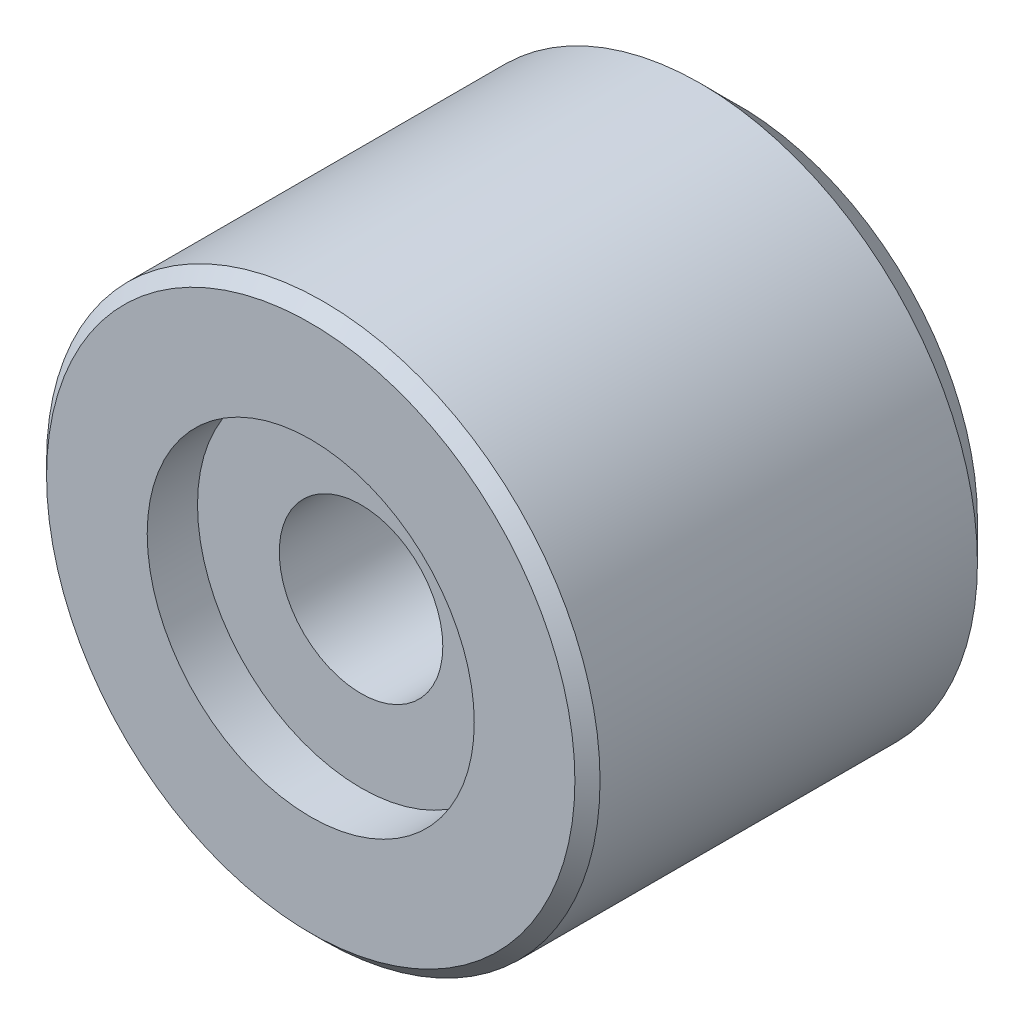
ISO-10303-21;
HEADER;
FILE_DESCRIPTION(('STEP AP214'),'2;1');
FILE_NAME('part.step','',(''),(''),'','','');
FILE_SCHEMA(('AUTOMOTIVE_DESIGN { 1 0 10303 214 1 1 1 1 }'));
ENDSEC;
DATA;
#1=APPLICATION_CONTEXT('core data for automotive mechanical design processes');
#2=APPLICATION_PROTOCOL_DEFINITION('international standard','automotive_design',2000,#1);
#3=PRODUCT_CONTEXT('',#1,'mechanical');
#4=PRODUCT('Part','Part','',(#3));
#5=PRODUCT_RELATED_PRODUCT_CATEGORY('part','',(#4));
#6=PRODUCT_DEFINITION_FORMATION('','',#4);
#7=PRODUCT_DEFINITION_CONTEXT('part definition',#1,'design');
#8=PRODUCT_DEFINITION('design','',#6,#7);
#9=PRODUCT_DEFINITION_SHAPE('','',#8);
#10=(LENGTH_UNIT() NAMED_UNIT(*) SI_UNIT(.MILLI.,.METRE.));
#11=(NAMED_UNIT(*) PLANE_ANGLE_UNIT() SI_UNIT($,.RADIAN.));
#12=(NAMED_UNIT(*) SI_UNIT($,.STERADIAN.) SOLID_ANGLE_UNIT());
#13=UNCERTAINTY_MEASURE_WITH_UNIT(LENGTH_MEASURE(1.E-05),#10,'distance_accuracy_value','');
#14=(GEOMETRIC_REPRESENTATION_CONTEXT(3) GLOBAL_UNCERTAINTY_ASSIGNED_CONTEXT((#13)) GLOBAL_UNIT_ASSIGNED_CONTEXT((#10,
#11,#12)) REPRESENTATION_CONTEXT('',''));
#15=CARTESIAN_POINT('',(0.,0.,0.));
#16=DIRECTION('',(0.,0.,1.));
#17=DIRECTION('',(1.,0.,0.));
#18=AXIS2_PLACEMENT_3D('',#15,#16,#17);
#19=CARTESIAN_POINT('',(1.6,2.82886903196313,4.5));
#20=DIRECTION('',(1.,0.,0.));
#21=DIRECTION('',(0.,0.,-1.));
#22=AXIS2_PLACEMENT_3D('',#19,#20,#21);
#23=PLANE('',#22);
#24=DIRECTION('',(0.,-1.,0.));
#25=VECTOR('',#24,1.);
#26=CARTESIAN_POINT('',(1.6,2.82886903196313,12.5));
#27=LINE('',#26,#25);
#28=CARTESIAN_POINT('',(1.6,2.82886903196313,12.5));
#29=VERTEX_POINT('',#28);
#30=CARTESIAN_POINT('',(1.6,-2.82886903196313,12.5));
#31=VERTEX_POINT('',#30);
#32=EDGE_CURVE('E60',#29,#31,#27,.T.);
#33=ORIENTED_EDGE('',*,*,#32,.F.);
#34=DIRECTION('',(0.,0.,1.));
#35=VECTOR('',#34,1.);
#36=CARTESIAN_POINT('',(1.6,2.82886903196313,4.5));
#37=LINE('',#36,#35);
#38=CARTESIAN_POINT('',(1.6,2.82886903196313,4.5));
#39=VERTEX_POINT('',#38);
#40=EDGE_CURVE('E54',#39,#29,#37,.T.);
#41=ORIENTED_EDGE('',*,*,#40,.F.);
#42=DIRECTION('',(0.,1.,0.));
#43=VECTOR('',#42,1.);
#44=CARTESIAN_POINT('',(1.6,2.82886903196313,4.5));
#45=LINE('',#44,#43);
#46=CARTESIAN_POINT('',(1.6,-2.82886903196313,4.5));
#47=VERTEX_POINT('',#46);
#48=EDGE_CURVE('E71',#47,#39,#45,.T.);
#49=ORIENTED_EDGE('',*,*,#48,.F.);
#50=DIRECTION('',(0.,0.,1.));
#51=VECTOR('',#50,1.);
#52=CARTESIAN_POINT('',(1.6,-2.82886903196313,4.5));
#53=LINE('',#52,#51);
#54=EDGE_CURVE('E67',#47,#31,#53,.T.);
#55=ORIENTED_EDGE('',*,*,#54,.T.);
#56=EDGE_LOOP('',(#33,#41,#49,#55));
#57=FACE_BOUND('',#56,.T.);
#58=ADVANCED_FACE('F33',(#57),#23,.F.);
#59=CARTESIAN_POINT('',(0.,0.,17.));
#60=DIRECTION('',(0.,0.,-1.));
#61=DIRECTION('',(-1.,0.,0.));
#62=AXIS2_PLACEMENT_3D('',#59,#60,#61);
#63=CYLINDRICAL_SURFACE('',#62,11.);
#64=CARTESIAN_POINT('',(0.,0.,16.5));
#65=DIRECTION('',(0.,0.,1.));
#66=DIRECTION('',(1.,0.,0.));
#67=AXIS2_PLACEMENT_3D('',#64,#65,#66);
#68=CIRCLE('',#67,11.);
#69=CARTESIAN_POINT('',(11.,0.,16.5));
#70=VERTEX_POINT('',#69);
#71=EDGE_CURVE('E11',#70,#70,#68,.F.);
#72=ORIENTED_EDGE('',*,*,#71,.T.);
#73=EDGE_LOOP('',(#72));
#74=FACE_BOUND('',#73,.T.);
#75=CARTESIAN_POINT('',(0.,0.,1.5));
#76=DIRECTION('',(0.,0.,1.));
#77=DIRECTION('',(1.,0.,0.));
#78=AXIS2_PLACEMENT_3D('',#75,#76,#77);
#79=CIRCLE('',#78,11.);
#80=CARTESIAN_POINT('',(11.,0.,1.5));
#81=VERTEX_POINT('',#80);
#82=EDGE_CURVE('E73',#81,#81,#79,.T.);
#83=ORIENTED_EDGE('',*,*,#82,.T.);
#84=EDGE_LOOP('',(#83));
#85=FACE_BOUND('',#84,.T.);
#86=ADVANCED_FACE('F97',(#74,#85),#63,.T.);
#87=CARTESIAN_POINT('',(0.,0.,17.));
#88=DIRECTION('',(0.,0.,1.));
#89=DIRECTION('',(1.,0.,0.));
#90=AXIS2_PLACEMENT_3D('',#87,#88,#89);
#91=PLANE('',#90);
#92=CARTESIAN_POINT('',(0.,0.,17.));
#93=DIRECTION('',(0.,0.,1.));
#94=DIRECTION('',(1.,0.,0.));
#95=AXIS2_PLACEMENT_3D('',#92,#93,#94);
#96=CIRCLE('',#95,10.5);
#97=CARTESIAN_POINT('',(10.5,0.,17.));
#98=VERTEX_POINT('',#97);
#99=EDGE_CURVE('E41',#98,#98,#96,.T.);
#100=ORIENTED_EDGE('',*,*,#99,.T.);
#101=EDGE_LOOP('',(#100));
#102=FACE_BOUND('',#101,.T.);
#103=CARTESIAN_POINT('',(0.,0.,17.));
#104=DIRECTION('',(0.,0.,1.));
#105=DIRECTION('',(1.,0.,0.));
#106=AXIS2_PLACEMENT_3D('',#103,#104,#105);
#107=CIRCLE('',#106,6.5);
#108=CARTESIAN_POINT('',(6.5,0.,17.));
#109=VERTEX_POINT('',#108);
#110=EDGE_CURVE('E63',#109,#109,#107,.T.);
#111=ORIENTED_EDGE('',*,*,#110,.F.);
#112=EDGE_LOOP('',(#111));
#113=FACE_BOUND('',#112,.T.);
#114=ADVANCED_FACE('F85',(#102,#113),#91,.T.);
#115=CARTESIAN_POINT('',(0.,0.,0.));
#116=DIRECTION('',(0.,0.,1.));
#117=DIRECTION('',(1.,0.,0.));
#118=AXIS2_PLACEMENT_3D('',#115,#116,#117);
#119=PLANE('',#118);
#120=CARTESIAN_POINT('',(0.,0.,0.));
#121=DIRECTION('',(0.,0.,1.));
#122=DIRECTION('',(1.,0.,0.));
#123=AXIS2_PLACEMENT_3D('',#120,#121,#122);
#124=CIRCLE('',#123,9.5);
#125=CARTESIAN_POINT('',(9.5,0.,0.));
#126=VERTEX_POINT('',#125);
#127=EDGE_CURVE('E80',#126,#126,#124,.F.);
#128=ORIENTED_EDGE('',*,*,#127,.T.);
#129=EDGE_LOOP('',(#128));
#130=FACE_BOUND('',#129,.T.);
#131=ADVANCED_FACE('F113',(#130),#119,.F.);
#132=CARTESIAN_POINT('',(0.,0.,15.));
#133=DIRECTION('',(0.,0.,1.));
#134=DIRECTION('',(1.,0.,0.));
#135=AXIS2_PLACEMENT_3D('',#132,#133,#134);
#136=PLANE('',#135);
#137=CARTESIAN_POINT('',(0.,0.,15.));
#138=DIRECTION('',(0.,0.,1.));
#139=DIRECTION('',(1.,0.,0.));
#140=AXIS2_PLACEMENT_3D('',#137,#138,#139);
#141=CIRCLE('',#140,3.25);
#142=CARTESIAN_POINT('',(3.25,0.,15.));
#143=VERTEX_POINT('',#142);
#144=EDGE_CURVE('E198',#143,#143,#141,.F.);
#145=ORIENTED_EDGE('',*,*,#144,.T.);
#146=EDGE_LOOP('',(#145));
#147=FACE_BOUND('',#146,.T.);
#148=CARTESIAN_POINT('',(0.,0.,15.));
#149=DIRECTION('',(0.,0.,1.));
#150=DIRECTION('',(1.,0.,0.));
#151=AXIS2_PLACEMENT_3D('',#148,#149,#150);
#152=CIRCLE('',#151,6.5);
#153=CARTESIAN_POINT('',(6.5,0.,15.));
#154=VERTEX_POINT('',#153);
#155=EDGE_CURVE('E200',#154,#154,#152,.T.);
#156=ORIENTED_EDGE('',*,*,#155,.T.);
#157=EDGE_LOOP('',(#156));
#158=FACE_BOUND('',#157,.T.);
#159=ADVANCED_FACE('F115',(#147,#158),#136,.T.);
#160=CARTESIAN_POINT('',(0.,0.,15.));
#161=DIRECTION('',(0.,0.,1.));
#162=DIRECTION('',(1.,0.,0.));
#163=AXIS2_PLACEMENT_3D('',#160,#161,#162);
#164=CYLINDRICAL_SURFACE('',#163,6.5);
#165=ORIENTED_EDGE('',*,*,#155,.F.);
#166=EDGE_LOOP('',(#165));
#167=FACE_BOUND('',#166,.T.);
#168=ORIENTED_EDGE('',*,*,#110,.T.);
#169=EDGE_LOOP('',(#168));
#170=FACE_BOUND('',#169,.T.);
#171=ADVANCED_FACE('F120',(#167,#170),#164,.F.);
#172=CARTESIAN_POINT('',(0.,0.,4.5));
#173=DIRECTION('',(0.,0.,1.));
#174=DIRECTION('',(1.,0.,0.));
#175=AXIS2_PLACEMENT_3D('',#172,#173,#174);
#176=PLANE('',#175);
#177=CARTESIAN_POINT('',(0.,0.,4.5));
#178=DIRECTION('',(0.,0.,1.));
#179=DIRECTION('',(1.,0.,0.));
#180=AXIS2_PLACEMENT_3D('',#177,#178,#179);
#181=CIRCLE('',#180,3.25);
#182=EDGE_CURVE('E75',#39,#47,#181,.T.);
#183=ORIENTED_EDGE('',*,*,#182,.T.);
#184=ORIENTED_EDGE('',*,*,#48,.T.);
#185=EDGE_LOOP('',(#183,#184));
#186=FACE_BOUND('',#185,.T.);
#187=ADVANCED_FACE('F106',(#186),#176,.T.);
#188=CARTESIAN_POINT('',(0.,0.,4.5));
#189=DIRECTION('',(0.,0.,1.));
#190=DIRECTION('',(1.,0.,0.));
#191=AXIS2_PLACEMENT_3D('',#188,#189,#190);
#192=CYLINDRICAL_SURFACE('',#191,3.25);
#193=ORIENTED_EDGE('',*,*,#144,.F.);
#194=EDGE_LOOP('',(#193));
#195=FACE_BOUND('',#194,.T.);
#196=ORIENTED_EDGE('',*,*,#40,.T.);
#197=CARTESIAN_POINT('',(0.,0.,12.5));
#198=DIRECTION('',(0.,0.,1.));
#199=DIRECTION('',(1.,0.,0.));
#200=AXIS2_PLACEMENT_3D('',#197,#198,#199);
#201=CIRCLE('',#200,3.25);
#202=EDGE_CURVE('E47',#31,#29,#201,.T.);
#203=ORIENTED_EDGE('',*,*,#202,.F.);
#204=ORIENTED_EDGE('',*,*,#54,.F.);
#205=ORIENTED_EDGE('',*,*,#182,.F.);
#206=EDGE_LOOP('',(#196,#203,#204,#205));
#207=FACE_BOUND('',#206,.T.);
#208=ADVANCED_FACE('F66',(#195,#207),#192,.F.);
#209=CARTESIAN_POINT('',(0.,0.,12.5));
#210=DIRECTION('',(0.,0.,1.));
#211=DIRECTION('',(1.,0.,0.));
#212=AXIS2_PLACEMENT_3D('',#209,#210,#211);
#213=PLANE('',#212);
#214=ORIENTED_EDGE('',*,*,#32,.T.);
#215=ORIENTED_EDGE('',*,*,#202,.T.);
#216=EDGE_LOOP('',(#214,#215));
#217=FACE_BOUND('',#216,.T.);
#218=ADVANCED_FACE('F61',(#217),#213,.T.);
#219=CARTESIAN_POINT('',(0.,0.,1.5));
#220=DIRECTION('',(0.,0.,1.));
#221=DIRECTION('',(1.,0.,0.));
#222=AXIS2_PLACEMENT_3D('',#219,#220,#221);
#223=CONICAL_SURFACE('',#222,11.,0.78539816339745);
#224=CARTESIAN_POINT('',(9.5,0.,0.));
#225=CARTESIAN_POINT('',(9.515625,0.,0.0156249999999997));
#226=CARTESIAN_POINT('',(9.53125,0.,0.0312499999999996));
#227=CARTESIAN_POINT('',(9.5625,0.,0.0624999999999996));
#228=CARTESIAN_POINT('',(9.578125,0.,0.0781249999999997));
#229=CARTESIAN_POINT('',(9.609375,0.,0.109375));
#230=CARTESIAN_POINT('',(9.625,0.,0.125));
#231=CARTESIAN_POINT('',(9.65625,0.,0.156249999999999));
#232=CARTESIAN_POINT('',(9.671875,0.,0.171874999999999));
#233=CARTESIAN_POINT('',(9.703125,0.,0.203124999999999));
#234=CARTESIAN_POINT('',(9.71875,0.,0.218749999999999));
#235=CARTESIAN_POINT('',(9.75,0.,0.249999999999999));
#236=CARTESIAN_POINT('',(9.765625,0.,0.265624999999999));
#237=CARTESIAN_POINT('',(9.796875,0.,0.296874999999999));
#238=CARTESIAN_POINT('',(9.8125,0.,0.312499999999999));
#239=CARTESIAN_POINT('',(9.84375,0.,0.343749999999999));
#240=CARTESIAN_POINT('',(9.859375,0.,0.359374999999999));
#241=CARTESIAN_POINT('',(9.890625,0.,0.390624999999999));
#242=CARTESIAN_POINT('',(9.90625,0.,0.406249999999999));
#243=CARTESIAN_POINT('',(9.9375,0.,0.437499999999999));
#244=CARTESIAN_POINT('',(9.953125,0.,0.453124999999999));
#245=CARTESIAN_POINT('',(9.984375,0.,0.484374999999999));
#246=CARTESIAN_POINT('',(10.,0.,0.499999999999999));
#247=CARTESIAN_POINT('',(10.03125,0.,0.531249999999998));
#248=CARTESIAN_POINT('',(10.046875,0.,0.546874999999998));
#249=CARTESIAN_POINT('',(10.078125,0.,0.578124999999998));
#250=CARTESIAN_POINT('',(10.09375,0.,0.593749999999998));
#251=CARTESIAN_POINT('',(10.125,0.,0.624999999999998));
#252=CARTESIAN_POINT('',(10.140625,0.,0.640624999999998));
#253=CARTESIAN_POINT('',(10.171875,0.,0.671874999999998));
#254=CARTESIAN_POINT('',(10.1875,0.,0.687499999999998));
#255=CARTESIAN_POINT('',(10.21875,0.,0.718749999999998));
#256=CARTESIAN_POINT('',(10.234375,0.,0.734374999999998));
#257=CARTESIAN_POINT('',(10.265625,0.,0.765624999999998));
#258=CARTESIAN_POINT('',(10.28125,0.,0.781249999999998));
#259=CARTESIAN_POINT('',(10.3125,0.,0.812499999999998));
#260=CARTESIAN_POINT('',(10.328125,0.,0.828124999999998));
#261=CARTESIAN_POINT('',(10.359375,0.,0.859374999999998));
#262=CARTESIAN_POINT('',(10.375,0.,0.874999999999998));
#263=CARTESIAN_POINT('',(10.40625,0.,0.906249999999997));
#264=CARTESIAN_POINT('',(10.421875,0.,0.921874999999997));
#265=CARTESIAN_POINT('',(10.453125,0.,0.953124999999997));
#266=CARTESIAN_POINT('',(10.46875,0.,0.968749999999997));
#267=CARTESIAN_POINT('',(10.5,0.,0.999999999999997));
#268=CARTESIAN_POINT('',(10.515625,0.,1.015625));
#269=CARTESIAN_POINT('',(10.546875,0.,1.046875));
#270=CARTESIAN_POINT('',(10.5625,0.,1.0625));
#271=CARTESIAN_POINT('',(10.59375,0.,1.09375));
#272=CARTESIAN_POINT('',(10.609375,0.,1.109375));
#273=CARTESIAN_POINT('',(10.640625,0.,1.140625));
#274=CARTESIAN_POINT('',(10.65625,0.,1.15625));
#275=CARTESIAN_POINT('',(10.6875,0.,1.1875));
#276=CARTESIAN_POINT('',(10.703125,0.,1.203125));
#277=CARTESIAN_POINT('',(10.734375,0.,1.234375));
#278=CARTESIAN_POINT('',(10.75,0.,1.25));
#279=CARTESIAN_POINT('',(10.78125,0.,1.28125));
#280=CARTESIAN_POINT('',(10.796875,0.,1.296875));
#281=CARTESIAN_POINT('',(10.828125,0.,1.328125));
#282=CARTESIAN_POINT('',(10.84375,0.,1.34375));
#283=CARTESIAN_POINT('',(10.875,0.,1.375));
#284=CARTESIAN_POINT('',(10.890625,0.,1.390625));
#285=CARTESIAN_POINT('',(10.921875,0.,1.421875));
#286=CARTESIAN_POINT('',(10.9375,0.,1.4375));
#287=CARTESIAN_POINT('',(10.96875,0.,1.46875));
#288=CARTESIAN_POINT('',(10.984375,0.,1.484375));
#289=CARTESIAN_POINT('',(11.,0.,1.5));
#290=B_SPLINE_CURVE_WITH_KNOTS('',3,(#224,#225,#226,#227,#228,#229,#230,#231,#232,#233,#234,
#235,#236,#237,#238,#239,#240,#241,#242,#243,#244,#245,#246,#247,#248,#249,#250,#251,#252,#253,
#254,#255,#256,#257,#258,#259,#260,#261,#262,#263,#264,#265,#266,#267,#268,#269,#270,#271,#272,
#273,#274,#275,#276,#277,#278,#279,#280,#281,#282,#283,#284,#285,#286,#287,#288,#289),
.UNSPECIFIED.,.F.,.F.,(4,2,2,2,2,2,2,2,2,2,2,2,2,2,2,2,2,2,2,2,2,2,2,2,2,2,2,2,2,2,2,2,4),(0.,
0.0662912607362387,0.132582521472478,0.198873782208716,0.265165042944955,0.331456303681194,
0.397747564417433,0.464038825153671,0.53033008588991,0.596621346626149,0.662912607362388,
0.729203868098626,0.795495128834865,0.861786389571104,0.928077650307343,0.994368911043581,
1.06066017177982,1.12695143251606,1.1932426932523,1.25953395398854,1.32582521472478,
1.39211647546101,1.45840773619725,1.52469899693349,1.59099025766973,1.65728151840597,
1.72357277914221,1.78986403987845,1.85615530061469,1.92244656135092,1.98873782208716,
2.0550290828234,2.12132034355964),.UNSPECIFIED.);
#291=EDGE_CURVE('BSEAM89',#126,#81,#290,.T.);
#292=ORIENTED_EDGE('',*,*,#127,.F.);
#293=ORIENTED_EDGE('',*,*,#82,.F.);
#294=ORIENTED_EDGE('',*,*,#291,.T.);
#295=ORIENTED_EDGE('',*,*,#291,.F.);
#296=EDGE_LOOP('',(#292,#294,#293,#295));
#297=FACE_BOUND('',#296,.T.);
#298=ADVANCED_FACE('F89',(#297),#223,.T.);
#299=CARTESIAN_POINT('',(0.,0.,17.));
#300=DIRECTION('',(0.,0.,-1.));
#301=DIRECTION('',(-1.,0.,0.));
#302=AXIS2_PLACEMENT_3D('',#299,#300,#301);
#303=CONICAL_SURFACE('',#302,10.5,0.785398163397445);
#304=ORIENTED_EDGE('',*,*,#71,.F.);
#305=EDGE_LOOP('',(#304));
#306=FACE_BOUND('',#305,.T.);
#307=ORIENTED_EDGE('',*,*,#99,.F.);
#308=EDGE_LOOP('',(#307));
#309=FACE_BOUND('',#308,.T.);
#310=ADVANCED_FACE('F35',(#306,#309),#303,.T.);
#311=CLOSED_SHELL('',(#58,#86,#114,#131,#159,#171,#187,#208,#218,#298,#310));
#312=MANIFOLD_SOLID_BREP('B2',#311);
#313=ADVANCED_BREP_SHAPE_REPRESENTATION('',(#18,#312),#14);
#314=SHAPE_DEFINITION_REPRESENTATION(#9,#313);
ENDSEC;
END-ISO-10303-21;
